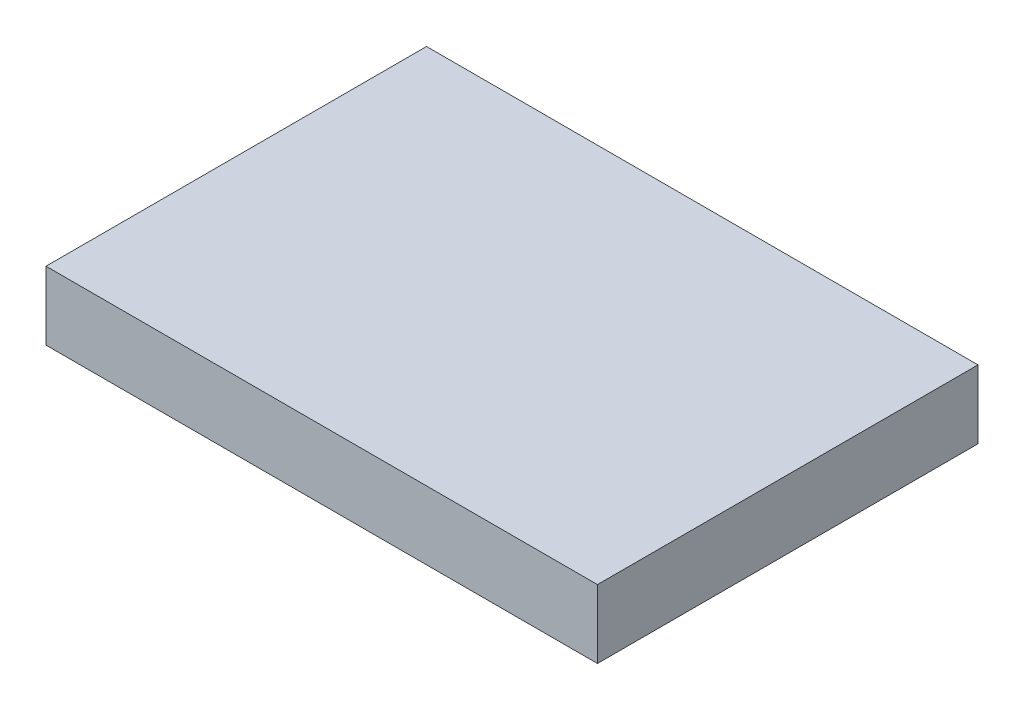
ISO-10303-21;
HEADER;
FILE_DESCRIPTION(('STEP AP214'),'2;1');
FILE_NAME('part.step','',(''),(''),'','','');
FILE_SCHEMA(('AUTOMOTIVE_DESIGN { 1 0 10303 214 1 1 1 1 }'));
ENDSEC;
DATA;
#1=APPLICATION_CONTEXT('core data for automotive mechanical design processes');
#2=APPLICATION_PROTOCOL_DEFINITION('international standard','automotive_design',2000,#1);
#3=PRODUCT_CONTEXT('',#1,'mechanical');
#4=PRODUCT('Part','Part','',(#3));
#5=PRODUCT_RELATED_PRODUCT_CATEGORY('part','',(#4));
#6=PRODUCT_DEFINITION_FORMATION('','',#4);
#7=PRODUCT_DEFINITION_CONTEXT('part definition',#1,'design');
#8=PRODUCT_DEFINITION('design','',#6,#7);
#9=PRODUCT_DEFINITION_SHAPE('','',#8);
#10=(LENGTH_UNIT() NAMED_UNIT(*) SI_UNIT(.MILLI.,.METRE.));
#11=(NAMED_UNIT(*) PLANE_ANGLE_UNIT() SI_UNIT($,.RADIAN.));
#12=(NAMED_UNIT(*) SI_UNIT($,.STERADIAN.) SOLID_ANGLE_UNIT());
#13=UNCERTAINTY_MEASURE_WITH_UNIT(LENGTH_MEASURE(1.E-05),#10,'distance_accuracy_value','');
#14=(GEOMETRIC_REPRESENTATION_CONTEXT(3) GLOBAL_UNCERTAINTY_ASSIGNED_CONTEXT((#13)) GLOBAL_UNIT_ASSIGNED_CONTEXT((#10,
#11,#12)) REPRESENTATION_CONTEXT('',''));
#15=CARTESIAN_POINT('',(0.,0.,0.));
#16=DIRECTION('',(0.,0.,1.));
#17=DIRECTION('',(1.,0.,0.));
#18=AXIS2_PLACEMENT_3D('',#15,#16,#17);
#19=CARTESIAN_POINT('',(16.6999999999999,76.2,-368.657716773723));
#20=DIRECTION('',(1.,0.,0.));
#21=DIRECTION('',(0.,0.,-1.));
#22=AXIS2_PLACEMENT_3D('',#19,#20,#21);
#23=PLANE('',#22);
#24=DIRECTION('',(0.,0.,1.));
#25=VECTOR('',#24,1.);
#26=CARTESIAN_POINT('',(16.6999999999999,0.,-368.657716773723));
#27=LINE('',#26,#25);
#28=CARTESIAN_POINT('',(16.6999999999999,0.,-368.657716773723));
#29=VERTEX_POINT('',#28);
#30=CARTESIAN_POINT('',(16.7,0.,55.5222832262772));
#31=VERTEX_POINT('',#30);
#32=EDGE_CURVE('E106',#29,#31,#27,.T.);
#33=ORIENTED_EDGE('',*,*,#32,.T.);
#34=DIRECTION('',(0.,-1.,0.));
#35=VECTOR('',#34,1.);
#36=CARTESIAN_POINT('',(16.7,76.2,55.5222832262772));
#37=LINE('',#36,#35);
#38=CARTESIAN_POINT('',(16.7,76.2,55.5222832262772));
#39=VERTEX_POINT('',#38);
#40=EDGE_CURVE('E11',#39,#31,#37,.T.);
#41=ORIENTED_EDGE('',*,*,#40,.F.);
#42=DIRECTION('',(0.,0.,1.));
#43=VECTOR('',#42,1.);
#44=CARTESIAN_POINT('',(16.6999999999999,76.2,-368.657716773723));
#45=LINE('',#44,#43);
#46=CARTESIAN_POINT('',(16.6999999999999,76.2,-368.657716773723));
#47=VERTEX_POINT('',#46);
#48=EDGE_CURVE('E94',#47,#39,#45,.T.);
#49=ORIENTED_EDGE('',*,*,#48,.F.);
#50=DIRECTION('',(0.,-1.,0.));
#51=VECTOR('',#50,1.);
#52=CARTESIAN_POINT('',(16.6999999999999,76.2,-368.657716773723));
#53=LINE('',#52,#51);
#54=EDGE_CURVE('E102',#47,#29,#53,.T.);
#55=ORIENTED_EDGE('',*,*,#54,.T.);
#56=EDGE_LOOP('',(#33,#41,#49,#55));
#57=FACE_BOUND('',#56,.T.);
#58=ADVANCED_FACE('F43',(#57),#23,.F.);
#59=CARTESIAN_POINT('',(16.7,76.2,55.5222832262772));
#60=DIRECTION('',(0.,0.,-1.));
#61=DIRECTION('',(-1.,0.,0.));
#62=AXIS2_PLACEMENT_3D('',#59,#60,#61);
#63=PLANE('',#62);
#64=DIRECTION('',(1.,0.,0.));
#65=VECTOR('',#64,1.);
#66=CARTESIAN_POINT('',(16.7,0.,55.5222832262772));
#67=LINE('',#66,#65);
#68=CARTESIAN_POINT('',(631.38,0.,55.5222832262772));
#69=VERTEX_POINT('',#68);
#70=EDGE_CURVE('E98',#31,#69,#67,.T.);
#71=ORIENTED_EDGE('',*,*,#70,.T.);
#72=DIRECTION('',(0.,-1.,0.));
#73=VECTOR('',#72,1.);
#74=CARTESIAN_POINT('',(631.38,76.2,55.5222832262772));
#75=LINE('',#74,#73);
#76=CARTESIAN_POINT('',(631.38,76.2,55.5222832262772));
#77=VERTEX_POINT('',#76);
#78=EDGE_CURVE('E51',#77,#69,#75,.T.);
#79=ORIENTED_EDGE('',*,*,#78,.F.);
#80=DIRECTION('',(1.,0.,0.));
#81=VECTOR('',#80,1.);
#82=CARTESIAN_POINT('',(16.7,76.2,55.5222832262772));
#83=LINE('',#82,#81);
#84=EDGE_CURVE('E89',#39,#77,#83,.T.);
#85=ORIENTED_EDGE('',*,*,#84,.F.);
#86=ORIENTED_EDGE('',*,*,#40,.T.);
#87=EDGE_LOOP('',(#71,#79,#85,#86));
#88=FACE_BOUND('',#87,.T.);
#89=ADVANCED_FACE('F97',(#88),#63,.F.);
#90=CARTESIAN_POINT('',(631.38,76.2,-368.657716773723));
#91=DIRECTION('',(-1.,0.,0.));
#92=DIRECTION('',(0.,0.,1.));
#93=AXIS2_PLACEMENT_3D('',#90,#91,#92);
#94=PLANE('',#93);
#95=DIRECTION('',(0.,0.,-1.));
#96=VECTOR('',#95,1.);
#97=CARTESIAN_POINT('',(631.38,0.,-368.657716773723));
#98=LINE('',#97,#96);
#99=CARTESIAN_POINT('',(631.38,0.,-368.657716773723));
#100=VERTEX_POINT('',#99);
#101=EDGE_CURVE('E76',#69,#100,#98,.T.);
#102=ORIENTED_EDGE('',*,*,#101,.T.);
#103=DIRECTION('',(0.,-1.,0.));
#104=VECTOR('',#103,1.);
#105=CARTESIAN_POINT('',(631.38,76.2,-368.657716773723));
#106=LINE('',#105,#104);
#107=CARTESIAN_POINT('',(631.38,76.2,-368.657716773723));
#108=VERTEX_POINT('',#107);
#109=EDGE_CURVE('E99',#108,#100,#106,.T.);
#110=ORIENTED_EDGE('',*,*,#109,.F.);
#111=DIRECTION('',(0.,0.,-1.));
#112=VECTOR('',#111,1.);
#113=CARTESIAN_POINT('',(631.38,76.2,-368.657716773723));
#114=LINE('',#113,#112);
#115=EDGE_CURVE('E92',#77,#108,#114,.T.);
#116=ORIENTED_EDGE('',*,*,#115,.F.);
#117=ORIENTED_EDGE('',*,*,#78,.T.);
#118=EDGE_LOOP('',(#102,#110,#116,#117));
#119=FACE_BOUND('',#118,.T.);
#120=ADVANCED_FACE('F100',(#119),#94,.F.);
#121=CARTESIAN_POINT('',(16.6999999999999,76.2,-368.657716773723));
#122=DIRECTION('',(0.,0.,1.));
#123=DIRECTION('',(1.,0.,0.));
#124=AXIS2_PLACEMENT_3D('',#121,#122,#123);
#125=PLANE('',#124);
#126=DIRECTION('',(-1.,0.,0.));
#127=VECTOR('',#126,1.);
#128=CARTESIAN_POINT('',(16.6999999999999,0.,-368.657716773723));
#129=LINE('',#128,#127);
#130=EDGE_CURVE('E82',#100,#29,#129,.T.);
#131=ORIENTED_EDGE('',*,*,#130,.T.);
#132=ORIENTED_EDGE('',*,*,#54,.F.);
#133=DIRECTION('',(-1.,0.,0.));
#134=VECTOR('',#133,1.);
#135=CARTESIAN_POINT('',(16.6999999999999,76.2,-368.657716773723));
#136=LINE('',#135,#134);
#137=EDGE_CURVE('E59',#108,#47,#136,.T.);
#138=ORIENTED_EDGE('',*,*,#137,.F.);
#139=ORIENTED_EDGE('',*,*,#109,.T.);
#140=EDGE_LOOP('',(#131,#132,#138,#139));
#141=FACE_BOUND('',#140,.T.);
#142=ADVANCED_FACE('F113',(#141),#125,.F.);
#143=CARTESIAN_POINT('',(0.,76.2,0.));
#144=DIRECTION('',(0.,1.,0.));
#145=DIRECTION('',(0.,0.,1.));
#146=AXIS2_PLACEMENT_3D('',#143,#144,#145);
#147=PLANE('',#146);
#148=ORIENTED_EDGE('',*,*,#48,.T.);
#149=ORIENTED_EDGE('',*,*,#84,.T.);
#150=ORIENTED_EDGE('',*,*,#115,.T.);
#151=ORIENTED_EDGE('',*,*,#137,.T.);
#152=EDGE_LOOP('',(#148,#149,#150,#151));
#153=FACE_BOUND('',#152,.T.);
#154=ADVANCED_FACE('F90',(#153),#147,.T.);
#155=CARTESIAN_POINT('',(0.,0.,0.));
#156=DIRECTION('',(0.,1.,0.));
#157=DIRECTION('',(0.,0.,1.));
#158=AXIS2_PLACEMENT_3D('',#155,#156,#157);
#159=PLANE('',#158);
#160=ORIENTED_EDGE('',*,*,#32,.F.);
#161=ORIENTED_EDGE('',*,*,#130,.F.);
#162=ORIENTED_EDGE('',*,*,#101,.F.);
#163=ORIENTED_EDGE('',*,*,#70,.F.);
#164=EDGE_LOOP('',(#160,#161,#162,#163));
#165=FACE_BOUND('',#164,.T.);
#166=ADVANCED_FACE('F116',(#165),#159,.F.);
#167=CLOSED_SHELL('',(#58,#89,#120,#142,#154,#166));
#168=MANIFOLD_SOLID_BREP('B2',#167);
#169=ADVANCED_BREP_SHAPE_REPRESENTATION('',(#18,#168),#14);
#170=SHAPE_DEFINITION_REPRESENTATION(#9,#169);
ENDSEC;
END-ISO-10303-21;
